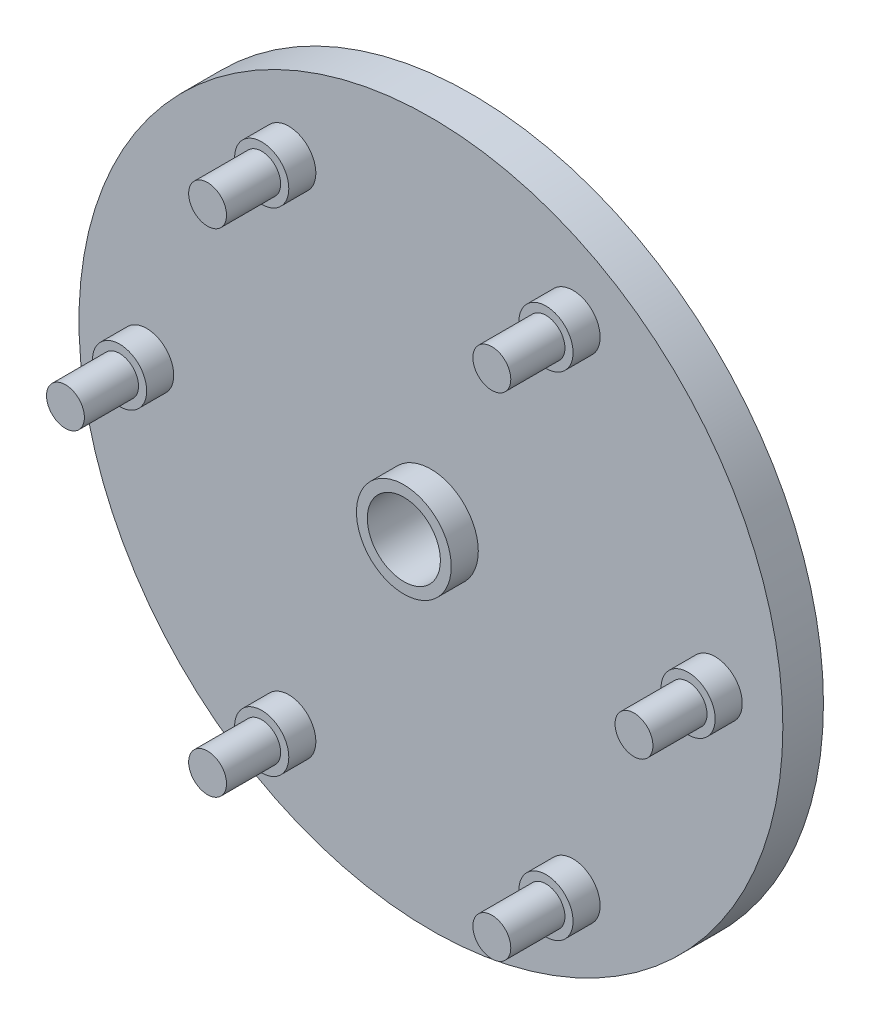
ISO-10303-21;
HEADER;
FILE_DESCRIPTION(('STEP AP214'),'2;1');
FILE_NAME('part.step','',(''),(''),'','','');
FILE_SCHEMA(('AUTOMOTIVE_DESIGN { 1 0 10303 214 1 1 1 1 }'));
ENDSEC;
DATA;
#1=APPLICATION_CONTEXT('core data for automotive mechanical design processes');
#2=APPLICATION_PROTOCOL_DEFINITION('international standard','automotive_design',2000,#1);
#3=PRODUCT_CONTEXT('',#1,'mechanical');
#4=PRODUCT('Part','Part','',(#3));
#5=PRODUCT_RELATED_PRODUCT_CATEGORY('part','',(#4));
#6=PRODUCT_DEFINITION_FORMATION('','',#4);
#7=PRODUCT_DEFINITION_CONTEXT('part definition',#1,'design');
#8=PRODUCT_DEFINITION('design','',#6,#7);
#9=PRODUCT_DEFINITION_SHAPE('','',#8);
#10=(LENGTH_UNIT() NAMED_UNIT(*) SI_UNIT(.MILLI.,.METRE.));
#11=(NAMED_UNIT(*) PLANE_ANGLE_UNIT() SI_UNIT($,.RADIAN.));
#12=(NAMED_UNIT(*) SI_UNIT($,.STERADIAN.) SOLID_ANGLE_UNIT());
#13=UNCERTAINTY_MEASURE_WITH_UNIT(LENGTH_MEASURE(1.E-05),#10,'distance_accuracy_value','');
#14=(GEOMETRIC_REPRESENTATION_CONTEXT(3) GLOBAL_UNCERTAINTY_ASSIGNED_CONTEXT((#13)) GLOBAL_UNIT_ASSIGNED_CONTEXT((#10,
#11,#12)) REPRESENTATION_CONTEXT('',''));
#15=CARTESIAN_POINT('',(0.,0.,0.));
#16=DIRECTION('',(0.,0.,1.));
#17=DIRECTION('',(1.,0.,0.));
#18=AXIS2_PLACEMENT_3D('',#15,#16,#17);
#19=CARTESIAN_POINT('',(0.,0.,0.));
#20=DIRECTION('',(0.,0.,1.));
#21=DIRECTION('',(1.,0.,0.));
#22=AXIS2_PLACEMENT_3D('',#19,#20,#21);
#23=PLANE('',#22);
#24=CARTESIAN_POINT('',(0.,0.,0.));
#25=DIRECTION('',(0.,0.,1.));
#26=DIRECTION('',(1.,0.,0.));
#27=AXIS2_PLACEMENT_3D('',#24,#25,#26);
#28=CIRCLE('',#27,26.);
#29=CARTESIAN_POINT('',(26.,0.,0.));
#30=VERTEX_POINT('',#29);
#31=EDGE_CURVE('E61',#30,#30,#28,.T.);
#32=ORIENTED_EDGE('',*,*,#31,.T.);
#33=EDGE_LOOP('',(#32));
#34=FACE_BOUND('',#33,.T.);
#35=CARTESIAN_POINT('',(-10.5,18.1865334794732,0.));
#36=DIRECTION('',(0.,0.,1.));
#37=DIRECTION('',(1.,0.,0.));
#38=AXIS2_PLACEMENT_3D('',#35,#36,#37);
#39=CIRCLE('',#38,1.99999999998604);
#40=CARTESIAN_POINT('',(-8.50000000001397,18.1865334794732,0.));
#41=VERTEX_POINT('',#40);
#42=EDGE_CURVE('E79',#41,#41,#39,.T.);
#43=ORIENTED_EDGE('',*,*,#42,.F.);
#44=EDGE_LOOP('',(#43));
#45=FACE_BOUND('',#44,.T.);
#46=CARTESIAN_POINT('',(10.4999999999876,18.1865334794804,0.));
#47=DIRECTION('',(0.,0.,1.));
#48=DIRECTION('',(1.,0.,0.));
#49=AXIS2_PLACEMENT_3D('',#46,#47,#48);
#50=CIRCLE('',#49,2.);
#51=CARTESIAN_POINT('',(12.4999999999876,18.1865334794804,0.));
#52=VERTEX_POINT('',#51);
#53=EDGE_CURVE('E80',#52,#52,#50,.T.);
#54=ORIENTED_EDGE('',*,*,#53,.F.);
#55=EDGE_LOOP('',(#54));
#56=FACE_BOUND('',#55,.T.);
#57=CARTESIAN_POINT('',(20.9999999999877,2.14224234048698E-11,0.));
#58=DIRECTION('',(0.,0.,1.));
#59=DIRECTION('',(1.,0.,0.));
#60=AXIS2_PLACEMENT_3D('',#57,#58,#59);
#61=CIRCLE('',#60,2.00000000000422);
#62=CARTESIAN_POINT('',(22.9999999999919,2.14224234048698E-11,0.));
#63=VERTEX_POINT('',#62);
#64=EDGE_CURVE('E85',#63,#63,#61,.T.);
#65=ORIENTED_EDGE('',*,*,#64,.F.);
#66=EDGE_LOOP('',(#65));
#67=FACE_BOUND('',#66,.T.);
#68=CARTESIAN_POINT('',(10.5,-18.1865334794447,0.));
#69=DIRECTION('',(0.,0.,1.));
#70=DIRECTION('',(1.,0.,0.));
#71=AXIS2_PLACEMENT_3D('',#68,#69,#70);
#72=CIRCLE('',#71,1.99999999999454);
#73=CARTESIAN_POINT('',(12.4999999999946,-18.1865334794447,0.));
#74=VERTEX_POINT('',#73);
#75=EDGE_CURVE('E89',#74,#74,#72,.T.);
#76=ORIENTED_EDGE('',*,*,#75,.F.);
#77=EDGE_LOOP('',(#76));
#78=FACE_BOUND('',#77,.T.);
#79=CARTESIAN_POINT('',(-10.4999999999876,-18.1865334794513,0.));
#80=DIRECTION('',(0.,0.,1.));
#81=DIRECTION('',(1.,0.,0.));
#82=AXIS2_PLACEMENT_3D('',#79,#80,#81);
#83=CIRCLE('',#82,1.99999999998034);
#84=CARTESIAN_POINT('',(-8.50000000000729,-18.1865334794513,0.));
#85=VERTEX_POINT('',#84);
#86=EDGE_CURVE('E93',#85,#85,#83,.T.);
#87=ORIENTED_EDGE('',*,*,#86,.F.);
#88=EDGE_LOOP('',(#87));
#89=FACE_BOUND('',#88,.T.);
#90=CARTESIAN_POINT('',(-20.9999999999877,7.12300700123801E-12,0.));
#91=DIRECTION('',(0.,0.,1.));
#92=DIRECTION('',(1.,0.,0.));
#93=AXIS2_PLACEMENT_3D('',#90,#91,#92);
#94=CIRCLE('',#93,1.99999999997655);
#95=CARTESIAN_POINT('',(-19.0000000000111,7.12300700123801E-12,0.));
#96=VERTEX_POINT('',#95);
#97=EDGE_CURVE('E185',#96,#96,#94,.T.);
#98=ORIENTED_EDGE('',*,*,#97,.F.);
#99=EDGE_LOOP('',(#98));
#100=FACE_BOUND('',#99,.T.);
#101=CARTESIAN_POINT('',(0.,-1.7130394325271E-13,0.));
#102=DIRECTION('',(0.,0.,1.));
#103=DIRECTION('',(1.,0.,0.));
#104=AXIS2_PLACEMENT_3D('',#101,#102,#103);
#105=CIRCLE('',#104,3.5);
#106=CARTESIAN_POINT('',(3.49999999999999,-1.7130394325271E-13,0.));
#107=VERTEX_POINT('',#106);
#108=EDGE_CURVE('E297',#107,#107,#105,.T.);
#109=ORIENTED_EDGE('',*,*,#108,.F.);
#110=EDGE_LOOP('',(#109));
#111=FACE_BOUND('',#110,.T.);
#112=ADVANCED_FACE('F53',(#34,#45,#56,#67,#78,#89,#100,#111),#23,.T.);
#113=CARTESIAN_POINT('',(0.,0.,-3.));
#114=DIRECTION('',(0.,0.,1.));
#115=DIRECTION('',(1.,0.,0.));
#116=AXIS2_PLACEMENT_3D('',#113,#114,#115);
#117=CYLINDRICAL_SURFACE('',#116,26.);
#118=CARTESIAN_POINT('',(0.,0.,-3.));
#119=DIRECTION('',(0.,0.,1.));
#120=DIRECTION('',(1.,0.,0.));
#121=AXIS2_PLACEMENT_3D('',#118,#119,#120);
#122=CIRCLE('',#121,26.);
#123=CARTESIAN_POINT('',(26.,0.,-3.));
#124=VERTEX_POINT('',#123);
#125=EDGE_CURVE('E11',#124,#124,#122,.T.);
#126=ORIENTED_EDGE('',*,*,#125,.T.);
#127=EDGE_LOOP('',(#126));
#128=FACE_BOUND('',#127,.T.);
#129=ORIENTED_EDGE('',*,*,#31,.F.);
#130=EDGE_LOOP('',(#129));
#131=FACE_BOUND('',#130,.T.);
#132=ADVANCED_FACE('F55',(#128,#131),#117,.T.);
#133=CARTESIAN_POINT('',(0.,0.,-3.));
#134=DIRECTION('',(0.,0.,1.));
#135=DIRECTION('',(1.,0.,0.));
#136=AXIS2_PLACEMENT_3D('',#133,#134,#135);
#137=PLANE('',#136);
#138=CARTESIAN_POINT('',(0.,0.,-3.));
#139=DIRECTION('',(0.,0.,1.));
#140=DIRECTION('',(1.,0.,0.));
#141=AXIS2_PLACEMENT_3D('',#138,#139,#140);
#142=CIRCLE('',#141,6.);
#143=CARTESIAN_POINT('',(6.,0.,-3.));
#144=VERTEX_POINT('',#143);
#145=EDGE_CURVE('E180',#144,#144,#142,.T.);
#146=ORIENTED_EDGE('',*,*,#145,.T.);
#147=EDGE_LOOP('',(#146));
#148=FACE_BOUND('',#147,.T.);
#149=ORIENTED_EDGE('',*,*,#125,.F.);
#150=EDGE_LOOP('',(#149));
#151=FACE_BOUND('',#150,.T.);
#152=ADVANCED_FACE('F167',(#148,#151),#137,.F.);
#153=CARTESIAN_POINT('',(-10.5,18.1865334794732,2.));
#154=DIRECTION('',(0.,0.,-1.));
#155=DIRECTION('',(-1.,0.,0.));
#156=AXIS2_PLACEMENT_3D('',#153,#154,#155);
#157=CYLINDRICAL_SURFACE('',#156,1.99999999998604);
#158=CARTESIAN_POINT('',(-10.5,18.1865334794732,2.));
#159=DIRECTION('',(0.,0.,1.));
#160=DIRECTION('',(1.,0.,0.));
#161=AXIS2_PLACEMENT_3D('',#158,#159,#160);
#162=CIRCLE('',#161,1.99999999998604);
#163=CARTESIAN_POINT('',(-8.50000000001397,18.1865334794732,2.));
#164=VERTEX_POINT('',#163);
#165=EDGE_CURVE('E75',#164,#164,#162,.T.);
#166=ORIENTED_EDGE('',*,*,#165,.F.);
#167=EDGE_LOOP('',(#166));
#168=FACE_BOUND('',#167,.T.);
#169=ORIENTED_EDGE('',*,*,#42,.T.);
#170=EDGE_LOOP('',(#169));
#171=FACE_BOUND('',#170,.T.);
#172=ADVANCED_FACE('F169',(#168,#171),#157,.T.);
#173=CARTESIAN_POINT('',(-10.5,18.1865334794732,2.));
#174=DIRECTION('',(0.,0.,1.));
#175=DIRECTION('',(1.,0.,0.));
#176=AXIS2_PLACEMENT_3D('',#173,#174,#175);
#177=PLANE('',#176);
#178=CARTESIAN_POINT('',(-10.5,18.1865334794732,2.));
#179=DIRECTION('',(0.,0.,1.));
#180=DIRECTION('',(1.,0.,0.));
#181=AXIS2_PLACEMENT_3D('',#178,#179,#180);
#182=CIRCLE('',#181,1.4);
#183=CARTESIAN_POINT('',(-9.1,18.1865334794732,2.));
#184=VERTEX_POINT('',#183);
#185=EDGE_CURVE('E71',#184,#184,#182,.T.);
#186=ORIENTED_EDGE('',*,*,#185,.F.);
#187=EDGE_LOOP('',(#186));
#188=FACE_BOUND('',#187,.T.);
#189=ORIENTED_EDGE('',*,*,#165,.T.);
#190=EDGE_LOOP('',(#189));
#191=FACE_BOUND('',#190,.T.);
#192=ADVANCED_FACE('F174',(#188,#191),#177,.T.);
#193=CARTESIAN_POINT('',(0.,0.,6.));
#194=DIRECTION('',(0.,0.,1.));
#195=DIRECTION('',(1.,0.,0.));
#196=AXIS2_PLACEMENT_3D('',#193,#194,#195);
#197=PLANE('',#196);
#198=CARTESIAN_POINT('',(-10.5,18.1865334794732,6.));
#199=DIRECTION('',(0.,0.,1.));
#200=DIRECTION('',(1.,0.,0.));
#201=AXIS2_PLACEMENT_3D('',#198,#199,#200);
#202=CIRCLE('',#201,1.4);
#203=CARTESIAN_POINT('',(-9.1,18.1865334794732,6.));
#204=VERTEX_POINT('',#203);
#205=EDGE_CURVE('E133',#204,#204,#202,.T.);
#206=ORIENTED_EDGE('',*,*,#205,.T.);
#207=EDGE_LOOP('',(#206));
#208=FACE_BOUND('',#207,.T.);
#209=ADVANCED_FACE('F250',(#208),#197,.T.);
#210=CARTESIAN_POINT('',(-10.5,18.1865334794732,6.));
#211=DIRECTION('',(0.,0.,-1.));
#212=DIRECTION('',(-1.,0.,0.));
#213=AXIS2_PLACEMENT_3D('',#210,#211,#212);
#214=CYLINDRICAL_SURFACE('',#213,1.4);
#215=ORIENTED_EDGE('',*,*,#185,.T.);
#216=EDGE_LOOP('',(#215));
#217=FACE_BOUND('',#216,.T.);
#218=ORIENTED_EDGE('',*,*,#205,.F.);
#219=EDGE_LOOP('',(#218));
#220=FACE_BOUND('',#219,.T.);
#221=ADVANCED_FACE('F243',(#217,#220),#214,.T.);
#222=CARTESIAN_POINT('',(10.4999999999876,18.1865334794804,2.));
#223=DIRECTION('',(0.,0.,-1.));
#224=DIRECTION('',(-1.,0.,0.));
#225=AXIS2_PLACEMENT_3D('',#222,#223,#224);
#226=CYLINDRICAL_SURFACE('',#225,2.);
#227=CARTESIAN_POINT('',(10.4999999999876,18.1865334794804,2.));
#228=DIRECTION('',(0.,0.,1.));
#229=DIRECTION('',(1.,0.,0.));
#230=AXIS2_PLACEMENT_3D('',#227,#228,#229);
#231=CIRCLE('',#230,2.);
#232=CARTESIAN_POINT('',(12.4999999999876,18.1865334794804,2.));
#233=VERTEX_POINT('',#232);
#234=EDGE_CURVE('E84',#233,#233,#231,.T.);
#235=ORIENTED_EDGE('',*,*,#234,.F.);
#236=EDGE_LOOP('',(#235));
#237=FACE_BOUND('',#236,.T.);
#238=ORIENTED_EDGE('',*,*,#53,.T.);
#239=EDGE_LOOP('',(#238));
#240=FACE_BOUND('',#239,.T.);
#241=ADVANCED_FACE('F239',(#237,#240),#226,.T.);
#242=CARTESIAN_POINT('',(10.4999999999876,18.1865334794804,2.));
#243=DIRECTION('',(0.,0.,1.));
#244=DIRECTION('',(1.,0.,0.));
#245=AXIS2_PLACEMENT_3D('',#242,#243,#244);
#246=PLANE('',#245);
#247=CARTESIAN_POINT('',(10.5,18.1865334794732,2.));
#248=DIRECTION('',(0.,0.,1.));
#249=DIRECTION('',(1.,0.,0.));
#250=AXIS2_PLACEMENT_3D('',#247,#248,#249);
#251=CIRCLE('',#250,1.4);
#252=CARTESIAN_POINT('',(11.9,18.1865334794732,2.));
#253=VERTEX_POINT('',#252);
#254=EDGE_CURVE('E76',#253,#253,#251,.T.);
#255=ORIENTED_EDGE('',*,*,#254,.F.);
#256=EDGE_LOOP('',(#255));
#257=FACE_BOUND('',#256,.T.);
#258=ORIENTED_EDGE('',*,*,#234,.T.);
#259=EDGE_LOOP('',(#258));
#260=FACE_BOUND('',#259,.T.);
#261=ADVANCED_FACE('F242',(#257,#260),#246,.T.);
#262=CARTESIAN_POINT('',(0.,0.,6.));
#263=DIRECTION('',(0.,0.,1.));
#264=DIRECTION('',(1.,0.,0.));
#265=AXIS2_PLACEMENT_3D('',#262,#263,#264);
#266=PLANE('',#265);
#267=CARTESIAN_POINT('',(10.5,18.1865334794732,6.));
#268=DIRECTION('',(0.,0.,1.));
#269=DIRECTION('',(1.,0.,0.));
#270=AXIS2_PLACEMENT_3D('',#267,#268,#269);
#271=CIRCLE('',#270,1.4);
#272=CARTESIAN_POINT('',(11.9,18.1865334794732,6.));
#273=VERTEX_POINT('',#272);
#274=EDGE_CURVE('E131',#273,#273,#271,.T.);
#275=ORIENTED_EDGE('',*,*,#274,.T.);
#276=EDGE_LOOP('',(#275));
#277=FACE_BOUND('',#276,.T.);
#278=ADVANCED_FACE('F247',(#277),#266,.T.);
#279=CARTESIAN_POINT('',(10.5,18.1865334794732,6.));
#280=DIRECTION('',(0.,0.,-1.));
#281=DIRECTION('',(-1.,0.,0.));
#282=AXIS2_PLACEMENT_3D('',#279,#280,#281);
#283=CYLINDRICAL_SURFACE('',#282,1.4);
#284=ORIENTED_EDGE('',*,*,#254,.T.);
#285=EDGE_LOOP('',(#284));
#286=FACE_BOUND('',#285,.T.);
#287=ORIENTED_EDGE('',*,*,#274,.F.);
#288=EDGE_LOOP('',(#287));
#289=FACE_BOUND('',#288,.T.);
#290=ADVANCED_FACE('F233',(#286,#289),#283,.T.);
#291=CARTESIAN_POINT('',(20.9999999999877,2.14224234048698E-11,2.));
#292=DIRECTION('',(0.,0.,-1.));
#293=DIRECTION('',(-1.,0.,0.));
#294=AXIS2_PLACEMENT_3D('',#291,#292,#293);
#295=CYLINDRICAL_SURFACE('',#294,2.00000000000422);
#296=CARTESIAN_POINT('',(20.9999999999877,2.14224234048698E-11,2.));
#297=DIRECTION('',(0.,0.,1.));
#298=DIRECTION('',(1.,0.,0.));
#299=AXIS2_PLACEMENT_3D('',#296,#297,#298);
#300=CIRCLE('',#299,2.00000000000422);
#301=CARTESIAN_POINT('',(22.9999999999919,2.14224234048698E-11,2.));
#302=VERTEX_POINT('',#301);
#303=EDGE_CURVE('E88',#302,#302,#300,.T.);
#304=ORIENTED_EDGE('',*,*,#303,.F.);
#305=EDGE_LOOP('',(#304));
#306=FACE_BOUND('',#305,.T.);
#307=ORIENTED_EDGE('',*,*,#64,.T.);
#308=EDGE_LOOP('',(#307));
#309=FACE_BOUND('',#308,.T.);
#310=ADVANCED_FACE('F229',(#306,#309),#295,.T.);
#311=CARTESIAN_POINT('',(20.9999999999877,2.14224234048698E-11,2.));
#312=DIRECTION('',(0.,0.,1.));
#313=DIRECTION('',(1.,0.,0.));
#314=AXIS2_PLACEMENT_3D('',#311,#312,#313);
#315=PLANE('',#314);
#316=CARTESIAN_POINT('',(21.,0.,2.));
#317=DIRECTION('',(0.,0.,1.));
#318=DIRECTION('',(1.,0.,0.));
#319=AXIS2_PLACEMENT_3D('',#316,#317,#318);
#320=CIRCLE('',#319,1.4);
#321=CARTESIAN_POINT('',(22.4,0.,2.));
#322=VERTEX_POINT('',#321);
#323=EDGE_CURVE('E81',#322,#322,#320,.T.);
#324=ORIENTED_EDGE('',*,*,#323,.F.);
#325=EDGE_LOOP('',(#324));
#326=FACE_BOUND('',#325,.T.);
#327=ORIENTED_EDGE('',*,*,#303,.T.);
#328=EDGE_LOOP('',(#327));
#329=FACE_BOUND('',#328,.T.);
#330=ADVANCED_FACE('F232',(#326,#329),#315,.T.);
#331=CARTESIAN_POINT('',(0.,0.,6.));
#332=DIRECTION('',(0.,0.,1.));
#333=DIRECTION('',(1.,0.,0.));
#334=AXIS2_PLACEMENT_3D('',#331,#332,#333);
#335=PLANE('',#334);
#336=CARTESIAN_POINT('',(21.,0.,6.));
#337=DIRECTION('',(0.,0.,1.));
#338=DIRECTION('',(1.,0.,0.));
#339=AXIS2_PLACEMENT_3D('',#336,#337,#338);
#340=CIRCLE('',#339,1.4);
#341=CARTESIAN_POINT('',(22.4,0.,6.));
#342=VERTEX_POINT('',#341);
#343=EDGE_CURVE('E128',#342,#342,#340,.T.);
#344=ORIENTED_EDGE('',*,*,#343,.T.);
#345=EDGE_LOOP('',(#344));
#346=FACE_BOUND('',#345,.T.);
#347=ADVANCED_FACE('F237',(#346),#335,.T.);
#348=CARTESIAN_POINT('',(21.,0.,6.));
#349=DIRECTION('',(0.,0.,-1.));
#350=DIRECTION('',(-1.,0.,0.));
#351=AXIS2_PLACEMENT_3D('',#348,#349,#350);
#352=CYLINDRICAL_SURFACE('',#351,1.4);
#353=ORIENTED_EDGE('',*,*,#323,.T.);
#354=EDGE_LOOP('',(#353));
#355=FACE_BOUND('',#354,.T.);
#356=ORIENTED_EDGE('',*,*,#343,.F.);
#357=EDGE_LOOP('',(#356));
#358=FACE_BOUND('',#357,.T.);
#359=ADVANCED_FACE('F223',(#355,#358),#352,.T.);
#360=CARTESIAN_POINT('',(10.5,-18.1865334794447,2.));
#361=DIRECTION('',(0.,0.,-1.));
#362=DIRECTION('',(-1.,0.,0.));
#363=AXIS2_PLACEMENT_3D('',#360,#361,#362);
#364=CYLINDRICAL_SURFACE('',#363,1.99999999999454);
#365=CARTESIAN_POINT('',(10.5,-18.1865334794447,2.));
#366=DIRECTION('',(0.,0.,1.));
#367=DIRECTION('',(1.,0.,0.));
#368=AXIS2_PLACEMENT_3D('',#365,#366,#367);
#369=CIRCLE('',#368,1.99999999999454);
#370=CARTESIAN_POINT('',(12.4999999999946,-18.1865334794447,2.));
#371=VERTEX_POINT('',#370);
#372=EDGE_CURVE('E92',#371,#371,#369,.T.);
#373=ORIENTED_EDGE('',*,*,#372,.F.);
#374=EDGE_LOOP('',(#373));
#375=FACE_BOUND('',#374,.T.);
#376=ORIENTED_EDGE('',*,*,#75,.T.);
#377=EDGE_LOOP('',(#376));
#378=FACE_BOUND('',#377,.T.);
#379=ADVANCED_FACE('F219',(#375,#378),#364,.T.);
#380=CARTESIAN_POINT('',(10.5,-18.1865334794447,2.));
#381=DIRECTION('',(0.,0.,1.));
#382=DIRECTION('',(1.,0.,0.));
#383=AXIS2_PLACEMENT_3D('',#380,#381,#382);
#384=PLANE('',#383);
#385=CARTESIAN_POINT('',(10.5,-18.1865334794732,2.));
#386=DIRECTION('',(0.,0.,1.));
#387=DIRECTION('',(1.,0.,0.));
#388=AXIS2_PLACEMENT_3D('',#385,#386,#387);
#389=CIRCLE('',#388,1.4);
#390=CARTESIAN_POINT('',(11.9,-18.1865334794732,2.));
#391=VERTEX_POINT('',#390);
#392=EDGE_CURVE('E86',#391,#391,#389,.T.);
#393=ORIENTED_EDGE('',*,*,#392,.F.);
#394=EDGE_LOOP('',(#393));
#395=FACE_BOUND('',#394,.T.);
#396=ORIENTED_EDGE('',*,*,#372,.T.);
#397=EDGE_LOOP('',(#396));
#398=FACE_BOUND('',#397,.T.);
#399=ADVANCED_FACE('F222',(#395,#398),#384,.T.);
#400=CARTESIAN_POINT('',(0.,0.,6.));
#401=DIRECTION('',(0.,0.,1.));
#402=DIRECTION('',(1.,0.,0.));
#403=AXIS2_PLACEMENT_3D('',#400,#401,#402);
#404=PLANE('',#403);
#405=CARTESIAN_POINT('',(10.5,-18.1865334794732,6.));
#406=DIRECTION('',(0.,0.,1.));
#407=DIRECTION('',(1.,0.,0.));
#408=AXIS2_PLACEMENT_3D('',#405,#406,#407);
#409=CIRCLE('',#408,1.4);
#410=CARTESIAN_POINT('',(11.9,-18.1865334794732,6.));
#411=VERTEX_POINT('',#410);
#412=EDGE_CURVE('E125',#411,#411,#409,.T.);
#413=ORIENTED_EDGE('',*,*,#412,.T.);
#414=EDGE_LOOP('',(#413));
#415=FACE_BOUND('',#414,.T.);
#416=ADVANCED_FACE('F227',(#415),#404,.T.);
#417=CARTESIAN_POINT('',(10.5,-18.1865334794732,6.));
#418=DIRECTION('',(0.,0.,-1.));
#419=DIRECTION('',(-1.,0.,0.));
#420=AXIS2_PLACEMENT_3D('',#417,#418,#419);
#421=CYLINDRICAL_SURFACE('',#420,1.4);
#422=ORIENTED_EDGE('',*,*,#392,.T.);
#423=EDGE_LOOP('',(#422));
#424=FACE_BOUND('',#423,.T.);
#425=ORIENTED_EDGE('',*,*,#412,.F.);
#426=EDGE_LOOP('',(#425));
#427=FACE_BOUND('',#426,.T.);
#428=ADVANCED_FACE('F214',(#424,#427),#421,.T.);
#429=CARTESIAN_POINT('',(-10.4999999999876,-18.1865334794513,2.));
#430=DIRECTION('',(0.,0.,-1.));
#431=DIRECTION('',(-1.,0.,0.));
#432=AXIS2_PLACEMENT_3D('',#429,#430,#431);
#433=CYLINDRICAL_SURFACE('',#432,1.99999999998034);
#434=CARTESIAN_POINT('',(-10.4999999999876,-18.1865334794513,2.));
#435=DIRECTION('',(0.,0.,1.));
#436=DIRECTION('',(1.,0.,0.));
#437=AXIS2_PLACEMENT_3D('',#434,#435,#436);
#438=CIRCLE('',#437,1.99999999998034);
#439=CARTESIAN_POINT('',(-8.50000000000729,-18.1865334794513,2.));
#440=VERTEX_POINT('',#439);
#441=EDGE_CURVE('E99',#440,#440,#438,.T.);
#442=ORIENTED_EDGE('',*,*,#441,.F.);
#443=EDGE_LOOP('',(#442));
#444=FACE_BOUND('',#443,.T.);
#445=ORIENTED_EDGE('',*,*,#86,.T.);
#446=EDGE_LOOP('',(#445));
#447=FACE_BOUND('',#446,.T.);
#448=ADVANCED_FACE('F210',(#444,#447),#433,.T.);
#449=CARTESIAN_POINT('',(-10.4999999999876,-18.1865334794513,2.));
#450=DIRECTION('',(0.,0.,1.));
#451=DIRECTION('',(1.,0.,0.));
#452=AXIS2_PLACEMENT_3D('',#449,#450,#451);
#453=PLANE('',#452);
#454=CARTESIAN_POINT('',(-10.5,-18.1865334794732,2.));
#455=DIRECTION('',(0.,0.,1.));
#456=DIRECTION('',(1.,0.,0.));
#457=AXIS2_PLACEMENT_3D('',#454,#455,#456);
#458=CIRCLE('',#457,1.4);
#459=CARTESIAN_POINT('',(-9.1,-18.1865334794732,2.));
#460=VERTEX_POINT('',#459);
#461=EDGE_CURVE('E90',#460,#460,#458,.T.);
#462=ORIENTED_EDGE('',*,*,#461,.F.);
#463=EDGE_LOOP('',(#462));
#464=FACE_BOUND('',#463,.T.);
#465=ORIENTED_EDGE('',*,*,#441,.T.);
#466=EDGE_LOOP('',(#465));
#467=FACE_BOUND('',#466,.T.);
#468=ADVANCED_FACE('F213',(#464,#467),#453,.T.);
#469=CARTESIAN_POINT('',(0.,0.,6.));
#470=DIRECTION('',(0.,0.,1.));
#471=DIRECTION('',(1.,0.,0.));
#472=AXIS2_PLACEMENT_3D('',#469,#470,#471);
#473=PLANE('',#472);
#474=CARTESIAN_POINT('',(-10.5,-18.1865334794732,6.));
#475=DIRECTION('',(0.,0.,1.));
#476=DIRECTION('',(1.,0.,0.));
#477=AXIS2_PLACEMENT_3D('',#474,#475,#476);
#478=CIRCLE('',#477,1.4);
#479=CARTESIAN_POINT('',(-9.1,-18.1865334794732,6.));
#480=VERTEX_POINT('',#479);
#481=EDGE_CURVE('E74',#480,#480,#478,.T.);
#482=ORIENTED_EDGE('',*,*,#481,.T.);
#483=EDGE_LOOP('',(#482));
#484=FACE_BOUND('',#483,.T.);
#485=ADVANCED_FACE('F206',(#484),#473,.T.);
#486=CARTESIAN_POINT('',(-10.5,-18.1865334794732,6.));
#487=DIRECTION('',(0.,0.,-1.));
#488=DIRECTION('',(-1.,0.,0.));
#489=AXIS2_PLACEMENT_3D('',#486,#487,#488);
#490=CYLINDRICAL_SURFACE('',#489,1.4);
#491=ORIENTED_EDGE('',*,*,#461,.T.);
#492=EDGE_LOOP('',(#491));
#493=FACE_BOUND('',#492,.T.);
#494=ORIENTED_EDGE('',*,*,#481,.F.);
#495=EDGE_LOOP('',(#494));
#496=FACE_BOUND('',#495,.T.);
#497=ADVANCED_FACE('F201',(#493,#496),#490,.T.);
#498=CARTESIAN_POINT('',(-20.9999999999877,7.12300700123801E-12,2.));
#499=DIRECTION('',(0.,0.,-1.));
#500=DIRECTION('',(-1.,0.,0.));
#501=AXIS2_PLACEMENT_3D('',#498,#499,#500);
#502=CYLINDRICAL_SURFACE('',#501,1.99999999997655);
#503=CARTESIAN_POINT('',(-20.9999999999877,7.12300700123801E-12,2.));
#504=DIRECTION('',(0.,0.,1.));
#505=DIRECTION('',(1.,0.,0.));
#506=AXIS2_PLACEMENT_3D('',#503,#504,#505);
#507=CIRCLE('',#506,1.99999999997655);
#508=CARTESIAN_POINT('',(-19.0000000000111,7.12300700123801E-12,2.));
#509=VERTEX_POINT('',#508);
#510=EDGE_CURVE('E106',#509,#509,#507,.T.);
#511=ORIENTED_EDGE('',*,*,#510,.F.);
#512=EDGE_LOOP('',(#511));
#513=FACE_BOUND('',#512,.T.);
#514=ORIENTED_EDGE('',*,*,#97,.T.);
#515=EDGE_LOOP('',(#514));
#516=FACE_BOUND('',#515,.T.);
#517=ADVANCED_FACE('F196',(#513,#516),#502,.T.);
#518=CARTESIAN_POINT('',(-20.9999999999877,7.12300700123801E-12,2.));
#519=DIRECTION('',(0.,0.,1.));
#520=DIRECTION('',(1.,0.,0.));
#521=AXIS2_PLACEMENT_3D('',#518,#519,#520);
#522=PLANE('',#521);
#523=CARTESIAN_POINT('',(-21.,0.,2.));
#524=DIRECTION('',(0.,0.,1.));
#525=DIRECTION('',(1.,0.,0.));
#526=AXIS2_PLACEMENT_3D('',#523,#524,#525);
#527=CIRCLE('',#526,1.4);
#528=CARTESIAN_POINT('',(-19.6,0.,2.));
#529=VERTEX_POINT('',#528);
#530=EDGE_CURVE('E57',#529,#529,#527,.T.);
#531=ORIENTED_EDGE('',*,*,#530,.F.);
#532=EDGE_LOOP('',(#531));
#533=FACE_BOUND('',#532,.T.);
#534=ORIENTED_EDGE('',*,*,#510,.T.);
#535=EDGE_LOOP('',(#534));
#536=FACE_BOUND('',#535,.T.);
#537=ADVANCED_FACE('F156',(#533,#536),#522,.T.);
#538=CARTESIAN_POINT('',(0.,0.,6.));
#539=DIRECTION('',(0.,0.,1.));
#540=DIRECTION('',(1.,0.,0.));
#541=AXIS2_PLACEMENT_3D('',#538,#539,#540);
#542=PLANE('',#541);
#543=CARTESIAN_POINT('',(-21.,0.,6.));
#544=DIRECTION('',(0.,0.,1.));
#545=DIRECTION('',(1.,0.,0.));
#546=AXIS2_PLACEMENT_3D('',#543,#544,#545);
#547=CIRCLE('',#546,1.4);
#548=CARTESIAN_POINT('',(-19.6,0.,6.));
#549=VERTEX_POINT('',#548);
#550=EDGE_CURVE('E66',#549,#549,#547,.T.);
#551=ORIENTED_EDGE('',*,*,#550,.T.);
#552=EDGE_LOOP('',(#551));
#553=FACE_BOUND('',#552,.T.);
#554=ADVANCED_FACE('F140',(#553),#542,.T.);
#555=CARTESIAN_POINT('',(-21.,0.,6.));
#556=DIRECTION('',(0.,0.,-1.));
#557=DIRECTION('',(-1.,0.,0.));
#558=AXIS2_PLACEMENT_3D('',#555,#556,#557);
#559=CYLINDRICAL_SURFACE('',#558,1.4);
#560=ORIENTED_EDGE('',*,*,#530,.T.);
#561=EDGE_LOOP('',(#560));
#562=FACE_BOUND('',#561,.T.);
#563=ORIENTED_EDGE('',*,*,#550,.F.);
#564=EDGE_LOOP('',(#563));
#565=FACE_BOUND('',#564,.T.);
#566=ADVANCED_FACE('F142',(#562,#565),#559,.T.);
#567=CARTESIAN_POINT('',(0.,0.,-8.));
#568=DIRECTION('',(0.,0.,1.));
#569=DIRECTION('',(1.,0.,0.));
#570=AXIS2_PLACEMENT_3D('',#567,#568,#569);
#571=CYLINDRICAL_SURFACE('',#570,6.);
#572=CARTESIAN_POINT('',(0.,0.,-8.));
#573=DIRECTION('',(0.,0.,1.));
#574=DIRECTION('',(1.,0.,0.));
#575=AXIS2_PLACEMENT_3D('',#572,#573,#574);
#576=CIRCLE('',#575,6.);
#577=CARTESIAN_POINT('',(6.,0.,-8.));
#578=VERTEX_POINT('',#577);
#579=EDGE_CURVE('E182',#578,#578,#576,.T.);
#580=ORIENTED_EDGE('',*,*,#579,.T.);
#581=EDGE_LOOP('',(#580));
#582=FACE_BOUND('',#581,.T.);
#583=ORIENTED_EDGE('',*,*,#145,.F.);
#584=EDGE_LOOP('',(#583));
#585=FACE_BOUND('',#584,.T.);
#586=ADVANCED_FACE('F144',(#582,#585),#571,.T.);
#587=CARTESIAN_POINT('',(0.,0.,-8.));
#588=DIRECTION('',(0.,0.,1.));
#589=DIRECTION('',(1.,0.,0.));
#590=AXIS2_PLACEMENT_3D('',#587,#588,#589);
#591=PLANE('',#590);
#592=CARTESIAN_POINT('',(0.,0.,-8.));
#593=DIRECTION('',(0.,0.,1.));
#594=DIRECTION('',(1.,0.,0.));
#595=AXIS2_PLACEMENT_3D('',#592,#593,#594);
#596=CIRCLE('',#595,2.7);
#597=CARTESIAN_POINT('',(2.7,0.,-8.));
#598=VERTEX_POINT('',#597);
#599=EDGE_CURVE('E187',#598,#598,#596,.T.);
#600=ORIENTED_EDGE('',*,*,#599,.T.);
#601=EDGE_LOOP('',(#600));
#602=FACE_BOUND('',#601,.T.);
#603=ORIENTED_EDGE('',*,*,#579,.F.);
#604=EDGE_LOOP('',(#603));
#605=FACE_BOUND('',#604,.T.);
#606=ADVANCED_FACE('F152',(#602,#605),#591,.F.);
#607=CARTESIAN_POINT('',(0.,0.,-8.));
#608=DIRECTION('',(0.,0.,1.));
#609=DIRECTION('',(1.,0.,0.));
#610=AXIS2_PLACEMENT_3D('',#607,#608,#609);
#611=CYLINDRICAL_SURFACE('',#610,2.7);
#612=ORIENTED_EDGE('',*,*,#599,.F.);
#613=EDGE_LOOP('',(#612));
#614=FACE_BOUND('',#613,.T.);
#615=CARTESIAN_POINT('',(0.,-1.7130394325271E-13,2.));
#616=DIRECTION('',(0.,0.,1.));
#617=DIRECTION('',(1.,0.,0.));
#618=AXIS2_PLACEMENT_3D('',#615,#616,#617);
#619=CIRCLE('',#618,2.7);
#620=CARTESIAN_POINT('',(2.69999999999999,-1.7130394325271E-13,2.));
#621=VERTEX_POINT('',#620);
#622=EDGE_CURVE('E300',#621,#621,#619,.T.);
#623=ORIENTED_EDGE('',*,*,#622,.T.);
#624=EDGE_LOOP('',(#623));
#625=FACE_BOUND('',#624,.T.);
#626=ADVANCED_FACE('F311',(#614,#625),#611,.F.);
#627=CARTESIAN_POINT('',(0.,-1.7130394325271E-13,2.));
#628=DIRECTION('',(0.,0.,1.));
#629=DIRECTION('',(1.,0.,0.));
#630=AXIS2_PLACEMENT_3D('',#627,#628,#629);
#631=PLANE('',#630);
#632=CARTESIAN_POINT('',(0.,-1.7130394325271E-13,2.));
#633=DIRECTION('',(0.,0.,1.));
#634=DIRECTION('',(1.,0.,0.));
#635=AXIS2_PLACEMENT_3D('',#632,#633,#634);
#636=CIRCLE('',#635,3.5);
#637=CARTESIAN_POINT('',(3.49999999999999,-1.7130394325271E-13,2.));
#638=VERTEX_POINT('',#637);
#639=EDGE_CURVE('E299',#638,#638,#636,.T.);
#640=ORIENTED_EDGE('',*,*,#639,.T.);
#641=EDGE_LOOP('',(#640));
#642=FACE_BOUND('',#641,.T.);
#643=ORIENTED_EDGE('',*,*,#622,.F.);
#644=EDGE_LOOP('',(#643));
#645=FACE_BOUND('',#644,.T.);
#646=ADVANCED_FACE('F313',(#642,#645),#631,.T.);
#647=CARTESIAN_POINT('',(0.,-1.7130394325271E-13,2.));
#648=DIRECTION('',(0.,0.,-1.));
#649=DIRECTION('',(-1.,0.,0.));
#650=AXIS2_PLACEMENT_3D('',#647,#648,#649);
#651=CYLINDRICAL_SURFACE('',#650,3.5);
#652=ORIENTED_EDGE('',*,*,#639,.F.);
#653=EDGE_LOOP('',(#652));
#654=FACE_BOUND('',#653,.T.);
#655=ORIENTED_EDGE('',*,*,#108,.T.);
#656=EDGE_LOOP('',(#655));
#657=FACE_BOUND('',#656,.T.);
#658=ADVANCED_FACE('F318',(#654,#657),#651,.T.);
#659=CLOSED_SHELL('',(#112,#132,#152,#172,#192,#209,#221,#241,#261,#278,#290,#310,#330,#347,
#359,#379,#399,#416,#428,#448,#468,#485,#497,#517,#537,#554,#566,#586,#606,#626,#646,#658));
#660=MANIFOLD_SOLID_BREP('B2',#659);
#661=ADVANCED_BREP_SHAPE_REPRESENTATION('',(#18,#660),#14);
#662=SHAPE_DEFINITION_REPRESENTATION(#9,#661);
ENDSEC;
END-ISO-10303-21;
